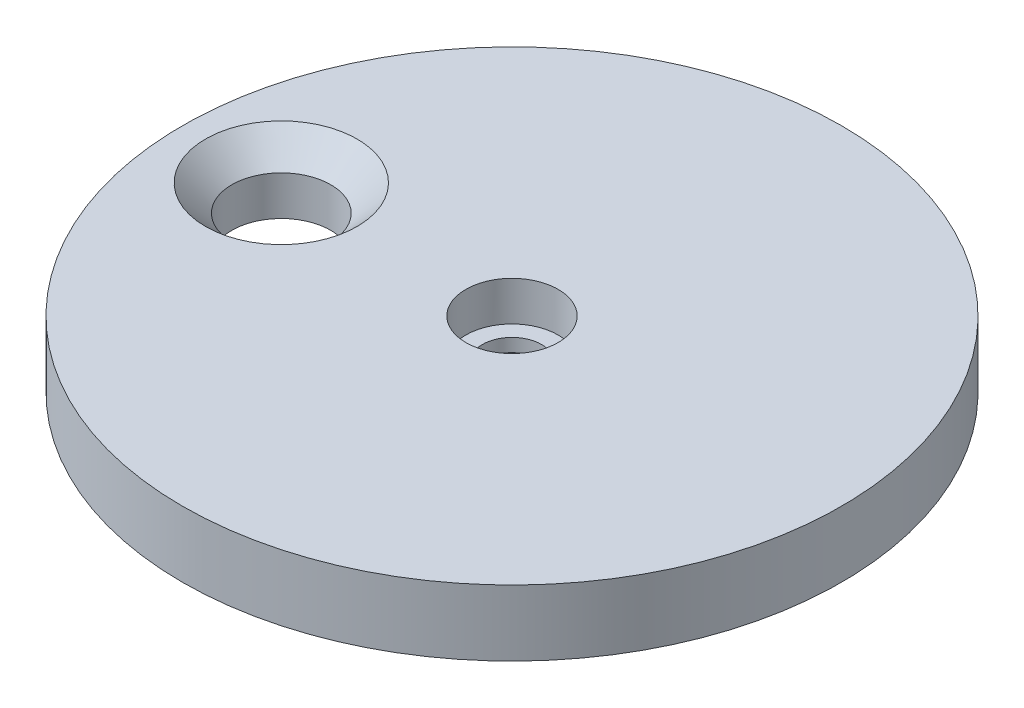
ISO-10303-21;
HEADER;
FILE_DESCRIPTION(('STEP AP214'),'2;1');
FILE_NAME('part.step','',(''),(''),'','','');
FILE_SCHEMA(('AUTOMOTIVE_DESIGN { 1 0 10303 214 1 1 1 1 }'));
ENDSEC;
DATA;
#1=APPLICATION_CONTEXT('core data for automotive mechanical design processes');
#2=APPLICATION_PROTOCOL_DEFINITION('international standard','automotive_design',2000,#1);
#3=PRODUCT_CONTEXT('',#1,'mechanical');
#4=PRODUCT('Part','Part','',(#3));
#5=PRODUCT_RELATED_PRODUCT_CATEGORY('part','',(#4));
#6=PRODUCT_DEFINITION_FORMATION('','',#4);
#7=PRODUCT_DEFINITION_CONTEXT('part definition',#1,'design');
#8=PRODUCT_DEFINITION('design','',#6,#7);
#9=PRODUCT_DEFINITION_SHAPE('','',#8);
#10=(LENGTH_UNIT() NAMED_UNIT(*) SI_UNIT(.MILLI.,.METRE.));
#11=(NAMED_UNIT(*) PLANE_ANGLE_UNIT() SI_UNIT($,.RADIAN.));
#12=(NAMED_UNIT(*) SI_UNIT($,.STERADIAN.) SOLID_ANGLE_UNIT());
#13=UNCERTAINTY_MEASURE_WITH_UNIT(LENGTH_MEASURE(1.E-05),#10,'distance_accuracy_value','');
#14=(GEOMETRIC_REPRESENTATION_CONTEXT(3) GLOBAL_UNCERTAINTY_ASSIGNED_CONTEXT((#13)) GLOBAL_UNIT_ASSIGNED_CONTEXT((#10,
#11,#12)) REPRESENTATION_CONTEXT('',''));
#15=CARTESIAN_POINT('',(0.,0.,0.));
#16=DIRECTION('',(0.,0.,1.));
#17=DIRECTION('',(1.,0.,0.));
#18=AXIS2_PLACEMENT_3D('',#15,#16,#17);
#19=CARTESIAN_POINT('',(0.,10.,0.));
#20=DIRECTION('',(0.,1.,0.));
#21=DIRECTION('',(0.,0.,1.));
#22=AXIS2_PLACEMENT_3D('',#19,#20,#21);
#23=PLANE('',#22);
#24=CARTESIAN_POINT('',(0.,10.,0.));
#25=DIRECTION('',(0.,1.,0.));
#26=DIRECTION('',(0.,0.,1.));
#27=AXIS2_PLACEMENT_3D('',#24,#25,#26);
#28=CIRCLE('',#27,7.);
#29=CARTESIAN_POINT('',(0.,10.,7.));
#30=VERTEX_POINT('',#29);
#31=EDGE_CURVE('E570',#30,#30,#28,.T.);
#32=ORIENTED_EDGE('',*,*,#31,.F.);
#33=EDGE_LOOP('',(#32));
#34=FACE_BOUND('',#33,.T.);
#35=CARTESIAN_POINT('',(-35.,10.,0.));
#36=DIRECTION('',(0.,1.,0.));
#37=DIRECTION('',(0.,0.,1.));
#38=AXIS2_PLACEMENT_3D('',#35,#36,#37);
#39=CIRCLE('',#38,11.5);
#40=CARTESIAN_POINT('',(-35.,10.,11.5));
#41=VERTEX_POINT('',#40);
#42=EDGE_CURVE('E12',#41,#41,#39,.F.);
#43=ORIENTED_EDGE('',*,*,#42,.T.);
#44=EDGE_LOOP('',(#43));
#45=FACE_BOUND('',#44,.T.);
#46=CARTESIAN_POINT('',(0.,10.,0.));
#47=DIRECTION('',(0.,1.,0.));
#48=DIRECTION('',(0.,0.,1.));
#49=AXIS2_PLACEMENT_3D('',#46,#47,#48);
#50=CIRCLE('',#49,50.);
#51=CARTESIAN_POINT('',(0.,10.,50.));
#52=VERTEX_POINT('',#51);
#53=EDGE_CURVE('E214',#52,#52,#50,.T.);
#54=ORIENTED_EDGE('',*,*,#53,.T.);
#55=EDGE_LOOP('',(#54));
#56=FACE_BOUND('',#55,.T.);
#57=ADVANCED_FACE('F35',(#34,#45,#56),#23,.T.);
#58=CARTESIAN_POINT('',(0.,0.,0.));
#59=DIRECTION('',(0.,1.,0.));
#60=DIRECTION('',(0.,0.,1.));
#61=AXIS2_PLACEMENT_3D('',#58,#59,#60);
#62=PLANE('',#61);
#63=DIRECTION('',(0.988417106108938,0.,-0.151761735464618));
#64=VECTOR('',#63,1.);
#65=CARTESIAN_POINT('',(-17.,0.,-2.5));
#66=LINE('',#65,#64);
#67=CARTESIAN_POINT('',(-17.,0.,-2.5));
#68=VERTEX_POINT('',#67);
#69=CARTESIAN_POINT('',(-4.43,0.,-4.43));
#70=VERTEX_POINT('',#69);
#71=EDGE_CURVE('E161',#68,#70,#66,.T.);
#72=ORIENTED_EDGE('',*,*,#71,.F.);
#73=CARTESIAN_POINT('',(-17.,0.,0.));
#74=DIRECTION('',(0.,-1.,0.));
#75=DIRECTION('',(0.,0.,-1.));
#76=AXIS2_PLACEMENT_3D('',#73,#74,#75);
#77=CIRCLE('',#76,2.5);
#78=CARTESIAN_POINT('',(-17.,0.,2.5));
#79=VERTEX_POINT('',#78);
#80=EDGE_CURVE('E51',#79,#68,#77,.T.);
#81=ORIENTED_EDGE('',*,*,#80,.F.);
#82=DIRECTION('',(-0.988417106108938,0.,-0.151761735464618));
#83=VECTOR('',#82,1.);
#84=CARTESIAN_POINT('',(-17.,0.,2.5));
#85=LINE('',#84,#83);
#86=CARTESIAN_POINT('',(-4.43,0.,4.43));
#87=VERTEX_POINT('',#86);
#88=EDGE_CURVE('E189',#87,#79,#85,.T.);
#89=ORIENTED_EDGE('',*,*,#88,.F.);
#90=DIRECTION('',(-0.151761735464618,0.,-0.988417106108938));
#91=VECTOR('',#90,1.);
#92=CARTESIAN_POINT('',(-2.5,0.,17.));
#93=LINE('',#92,#91);
#94=CARTESIAN_POINT('',(-2.5,0.,17.));
#95=VERTEX_POINT('',#94);
#96=EDGE_CURVE('E187',#95,#87,#93,.T.);
#97=ORIENTED_EDGE('',*,*,#96,.F.);
#98=CARTESIAN_POINT('',(0.,0.,17.));
#99=DIRECTION('',(0.,-1.,0.));
#100=DIRECTION('',(0.,0.,-1.));
#101=AXIS2_PLACEMENT_3D('',#98,#99,#100);
#102=CIRCLE('',#101,2.5);
#103=CARTESIAN_POINT('',(2.5,0.,17.));
#104=VERTEX_POINT('',#103);
#105=EDGE_CURVE('E135',#104,#95,#102,.T.);
#106=ORIENTED_EDGE('',*,*,#105,.F.);
#107=DIRECTION('',(-0.151761735464618,0.,0.988417106108938));
#108=VECTOR('',#107,1.);
#109=CARTESIAN_POINT('',(2.5,0.,17.));
#110=LINE('',#109,#108);
#111=CARTESIAN_POINT('',(4.43,0.,4.43));
#112=VERTEX_POINT('',#111);
#113=EDGE_CURVE('E183',#112,#104,#110,.T.);
#114=ORIENTED_EDGE('',*,*,#113,.F.);
#115=DIRECTION('',(-0.988417106108938,0.,0.151761735464618));
#116=VECTOR('',#115,1.);
#117=CARTESIAN_POINT('',(17.,0.,2.5));
#118=LINE('',#117,#116);
#119=CARTESIAN_POINT('',(17.,0.,2.5));
#120=VERTEX_POINT('',#119);
#121=EDGE_CURVE('E180',#120,#112,#118,.T.);
#122=ORIENTED_EDGE('',*,*,#121,.F.);
#123=CARTESIAN_POINT('',(17.,0.,0.));
#124=DIRECTION('',(0.,-1.,0.));
#125=DIRECTION('',(0.,0.,-1.));
#126=AXIS2_PLACEMENT_3D('',#123,#124,#125);
#127=CIRCLE('',#126,2.5);
#128=CARTESIAN_POINT('',(17.,0.,-2.5));
#129=VERTEX_POINT('',#128);
#130=EDGE_CURVE('E177',#129,#120,#127,.T.);
#131=ORIENTED_EDGE('',*,*,#130,.F.);
#132=DIRECTION('',(0.988417106108938,0.,0.151761735464618));
#133=VECTOR('',#132,1.);
#134=CARTESIAN_POINT('',(17.,0.,-2.5));
#135=LINE('',#134,#133);
#136=CARTESIAN_POINT('',(4.43,0.,-4.43));
#137=VERTEX_POINT('',#136);
#138=EDGE_CURVE('E174',#137,#129,#135,.T.);
#139=ORIENTED_EDGE('',*,*,#138,.F.);
#140=DIRECTION('',(0.151761735464618,0.,0.988417106108938));
#141=VECTOR('',#140,1.);
#142=CARTESIAN_POINT('',(2.50000000000001,0.,-17.));
#143=LINE('',#142,#141);
#144=CARTESIAN_POINT('',(2.50000000000001,0.,-17.));
#145=VERTEX_POINT('',#144);
#146=EDGE_CURVE('E171',#145,#137,#143,.T.);
#147=ORIENTED_EDGE('',*,*,#146,.F.);
#148=CARTESIAN_POINT('',(0.,0.,-17.));
#149=DIRECTION('',(0.,-1.,0.));
#150=DIRECTION('',(0.,0.,-1.));
#151=AXIS2_PLACEMENT_3D('',#148,#149,#150);
#152=CIRCLE('',#151,2.5);
#153=CARTESIAN_POINT('',(-2.49999999999999,0.,-17.));
#154=VERTEX_POINT('',#153);
#155=EDGE_CURVE('E168',#154,#145,#152,.T.);
#156=ORIENTED_EDGE('',*,*,#155,.F.);
#157=DIRECTION('',(0.151761735464618,0.,-0.988417106108938));
#158=VECTOR('',#157,1.);
#159=CARTESIAN_POINT('',(-2.49999999999999,0.,-17.));
#160=LINE('',#159,#158);
#161=EDGE_CURVE('E165',#70,#154,#160,.T.);
#162=ORIENTED_EDGE('',*,*,#161,.F.);
#163=EDGE_LOOP('',(#72,#81,#89,#97,#106,#114,#122,#131,#139,#147,#156,#162));
#164=FACE_BOUND('',#163,.T.);
#165=CARTESIAN_POINT('',(0.,0.,0.));
#166=DIRECTION('',(0.,1.,0.));
#167=DIRECTION('',(0.,0.,1.));
#168=AXIS2_PLACEMENT_3D('',#165,#166,#167);
#169=CIRCLE('',#168,50.);
#170=CARTESIAN_POINT('',(0.,0.,50.));
#171=VERTEX_POINT('',#170);
#172=EDGE_CURVE('E213',#171,#171,#169,.T.);
#173=ORIENTED_EDGE('',*,*,#172,.F.);
#174=EDGE_LOOP('',(#173));
#175=FACE_BOUND('',#174,.T.);
#176=CARTESIAN_POINT('',(-35.,0.,0.));
#177=DIRECTION('',(0.,1.,0.));
#178=DIRECTION('',(0.,0.,1.));
#179=AXIS2_PLACEMENT_3D('',#176,#177,#178);
#180=CIRCLE('',#179,7.5);
#181=CARTESIAN_POINT('',(-35.,0.,7.5));
#182=VERTEX_POINT('',#181);
#183=EDGE_CURVE('E193',#182,#182,#180,.T.);
#184=ORIENTED_EDGE('',*,*,#183,.T.);
#185=EDGE_LOOP('',(#184));
#186=FACE_BOUND('',#185,.T.);
#187=ADVANCED_FACE('F239',(#164,#175,#186),#62,.F.);
#188=CARTESIAN_POINT('',(0.,10.,0.));
#189=DIRECTION('',(0.,-1.,0.));
#190=DIRECTION('',(0.,0.,-1.));
#191=AXIS2_PLACEMENT_3D('',#188,#189,#190);
#192=CYLINDRICAL_SURFACE('',#191,50.);
#193=ORIENTED_EDGE('',*,*,#53,.F.);
#194=EDGE_LOOP('',(#193));
#195=FACE_BOUND('',#194,.T.);
#196=ORIENTED_EDGE('',*,*,#172,.T.);
#197=EDGE_LOOP('',(#196));
#198=FACE_BOUND('',#197,.T.);
#199=ADVANCED_FACE('F235',(#195,#198),#192,.T.);
#200=CARTESIAN_POINT('',(-35.,10.,0.));
#201=DIRECTION('',(0.,-1.,0.));
#202=DIRECTION('',(0.,0.,-1.));
#203=AXIS2_PLACEMENT_3D('',#200,#201,#202);
#204=CYLINDRICAL_SURFACE('',#203,7.5);
#205=CARTESIAN_POINT('',(-35.,5.99999999999999,0.));
#206=DIRECTION('',(0.,1.,0.));
#207=DIRECTION('',(0.,0.,1.));
#208=AXIS2_PLACEMENT_3D('',#205,#206,#207);
#209=CIRCLE('',#208,7.5);
#210=CARTESIAN_POINT('',(-35.,5.99999999999999,7.5));
#211=VERTEX_POINT('',#210);
#212=EDGE_CURVE('E44',#211,#211,#209,.T.);
#213=ORIENTED_EDGE('',*,*,#212,.T.);
#214=EDGE_LOOP('',(#213));
#215=FACE_BOUND('',#214,.T.);
#216=ORIENTED_EDGE('',*,*,#183,.F.);
#217=EDGE_LOOP('',(#216));
#218=FACE_BOUND('',#217,.T.);
#219=ADVANCED_FACE('F222',(#215,#218),#204,.F.);
#220=CARTESIAN_POINT('',(-35.,5.99999999999999,0.));
#221=DIRECTION('',(0.,1.,0.));
#222=DIRECTION('',(0.,0.,1.));
#223=AXIS2_PLACEMENT_3D('',#220,#221,#222);
#224=CONICAL_SURFACE('',#223,7.5,0.78539816339745);
#225=ORIENTED_EDGE('',*,*,#42,.F.);
#226=EDGE_LOOP('',(#225));
#227=FACE_BOUND('',#226,.T.);
#228=ORIENTED_EDGE('',*,*,#212,.F.);
#229=EDGE_LOOP('',(#228));
#230=FACE_BOUND('',#229,.T.);
#231=ADVANCED_FACE('F37',(#227,#230),#224,.F.);
#232=CARTESIAN_POINT('',(-17.,2.,0.));
#233=DIRECTION('',(0.,-1.,0.));
#234=DIRECTION('',(0.,0.,-1.));
#235=AXIS2_PLACEMENT_3D('',#232,#233,#234);
#236=CYLINDRICAL_SURFACE('',#235,2.5);
#237=ORIENTED_EDGE('',*,*,#80,.T.);
#238=DIRECTION('',(0.,-1.,0.));
#239=VECTOR('',#238,1.);
#240=CARTESIAN_POINT('',(-17.,2.,-2.5));
#241=LINE('',#240,#239);
#242=CARTESIAN_POINT('',(-17.,2.,-2.5));
#243=VERTEX_POINT('',#242);
#244=EDGE_CURVE('E99',#243,#68,#241,.T.);
#245=ORIENTED_EDGE('',*,*,#244,.F.);
#246=CARTESIAN_POINT('',(-17.,2.,0.));
#247=DIRECTION('',(0.,-1.,0.));
#248=DIRECTION('',(0.,0.,-1.));
#249=AXIS2_PLACEMENT_3D('',#246,#247,#248);
#250=CIRCLE('',#249,2.5);
#251=CARTESIAN_POINT('',(-17.,2.,2.5));
#252=VERTEX_POINT('',#251);
#253=EDGE_CURVE('E191',#252,#243,#250,.T.);
#254=ORIENTED_EDGE('',*,*,#253,.F.);
#255=DIRECTION('',(0.,-1.,0.));
#256=VECTOR('',#255,1.);
#257=CARTESIAN_POINT('',(-17.,2.,2.5));
#258=LINE('',#257,#256);
#259=EDGE_CURVE('E59',#252,#79,#258,.T.);
#260=ORIENTED_EDGE('',*,*,#259,.T.);
#261=EDGE_LOOP('',(#237,#245,#254,#260));
#262=FACE_BOUND('',#261,.T.);
#263=ADVANCED_FACE('F226',(#262),#236,.F.);
#264=CARTESIAN_POINT('',(-17.,2.,2.5));
#265=DIRECTION('',(-0.151761735464618,0.,0.988417106108938));
#266=DIRECTION('',(0.988417106108938,0.,0.151761735464618));
#267=AXIS2_PLACEMENT_3D('',#264,#265,#266);
#268=PLANE('',#267);
#269=ORIENTED_EDGE('',*,*,#88,.T.);
#270=ORIENTED_EDGE('',*,*,#259,.F.);
#271=DIRECTION('',(-0.988417106108938,0.,-0.151761735464618));
#272=VECTOR('',#271,1.);
#273=CARTESIAN_POINT('',(-17.,2.,2.5));
#274=LINE('',#273,#272);
#275=CARTESIAN_POINT('',(-4.43,2.,4.43));
#276=VERTEX_POINT('',#275);
#277=EDGE_CURVE('E147',#276,#252,#274,.T.);
#278=ORIENTED_EDGE('',*,*,#277,.F.);
#279=DIRECTION('',(0.,-1.,0.));
#280=VECTOR('',#279,1.);
#281=CARTESIAN_POINT('',(-4.43,2.,4.43));
#282=LINE('',#281,#280);
#283=EDGE_CURVE('E139',#276,#87,#282,.T.);
#284=ORIENTED_EDGE('',*,*,#283,.T.);
#285=EDGE_LOOP('',(#269,#270,#278,#284));
#286=FACE_BOUND('',#285,.T.);
#287=ADVANCED_FACE('F232',(#286),#268,.F.);
#288=CARTESIAN_POINT('',(-2.5,2.,17.));
#289=DIRECTION('',(-0.988417106108938,0.,0.151761735464618));
#290=DIRECTION('',(0.151761735464618,0.,0.988417106108938));
#291=AXIS2_PLACEMENT_3D('',#288,#289,#290);
#292=PLANE('',#291);
#293=ORIENTED_EDGE('',*,*,#96,.T.);
#294=ORIENTED_EDGE('',*,*,#283,.F.);
#295=DIRECTION('',(-0.151761735464618,0.,-0.988417106108938));
#296=VECTOR('',#295,1.);
#297=CARTESIAN_POINT('',(-2.5,2.,17.));
#298=LINE('',#297,#296);
#299=CARTESIAN_POINT('',(-2.5,2.,17.));
#300=VERTEX_POINT('',#299);
#301=EDGE_CURVE('E143',#300,#276,#298,.T.);
#302=ORIENTED_EDGE('',*,*,#301,.F.);
#303=DIRECTION('',(0.,-1.,0.));
#304=VECTOR('',#303,1.);
#305=CARTESIAN_POINT('',(-2.5,2.,17.));
#306=LINE('',#305,#304);
#307=EDGE_CURVE('E128',#300,#95,#306,.T.);
#308=ORIENTED_EDGE('',*,*,#307,.T.);
#309=EDGE_LOOP('',(#293,#294,#302,#308));
#310=FACE_BOUND('',#309,.T.);
#311=ADVANCED_FACE('F144',(#310),#292,.F.);
#312=CARTESIAN_POINT('',(0.,2.,17.));
#313=DIRECTION('',(0.,-1.,0.));
#314=DIRECTION('',(0.,0.,-1.));
#315=AXIS2_PLACEMENT_3D('',#312,#313,#314);
#316=CYLINDRICAL_SURFACE('',#315,2.5);
#317=ORIENTED_EDGE('',*,*,#105,.T.);
#318=ORIENTED_EDGE('',*,*,#307,.F.);
#319=CARTESIAN_POINT('',(0.,2.,17.));
#320=DIRECTION('',(0.,-1.,0.));
#321=DIRECTION('',(0.,0.,-1.));
#322=AXIS2_PLACEMENT_3D('',#319,#320,#321);
#323=CIRCLE('',#322,2.5);
#324=CARTESIAN_POINT('',(2.5,2.,17.));
#325=VERTEX_POINT('',#324);
#326=EDGE_CURVE('E132',#325,#300,#323,.T.);
#327=ORIENTED_EDGE('',*,*,#326,.F.);
#328=DIRECTION('',(0.,-1.,0.));
#329=VECTOR('',#328,1.);
#330=CARTESIAN_POINT('',(2.5,2.,17.));
#331=LINE('',#330,#329);
#332=EDGE_CURVE('E140',#325,#104,#331,.T.);
#333=ORIENTED_EDGE('',*,*,#332,.T.);
#334=EDGE_LOOP('',(#317,#318,#327,#333));
#335=FACE_BOUND('',#334,.T.);
#336=ADVANCED_FACE('F130',(#335),#316,.F.);
#337=CARTESIAN_POINT('',(2.5,2.,17.));
#338=DIRECTION('',(0.988417106108938,0.,0.151761735464618));
#339=DIRECTION('',(0.151761735464618,0.,-0.988417106108938));
#340=AXIS2_PLACEMENT_3D('',#337,#338,#339);
#341=PLANE('',#340);
#342=ORIENTED_EDGE('',*,*,#113,.T.);
#343=ORIENTED_EDGE('',*,*,#332,.F.);
#344=DIRECTION('',(-0.151761735464618,0.,0.988417106108938));
#345=VECTOR('',#344,1.);
#346=CARTESIAN_POINT('',(2.5,2.,17.));
#347=LINE('',#346,#345);
#348=CARTESIAN_POINT('',(4.43,2.,4.43));
#349=VERTEX_POINT('',#348);
#350=EDGE_CURVE('E153',#349,#325,#347,.T.);
#351=ORIENTED_EDGE('',*,*,#350,.F.);
#352=DIRECTION('',(0.,-1.,0.));
#353=VECTOR('',#352,1.);
#354=CARTESIAN_POINT('',(4.43,2.,4.43));
#355=LINE('',#354,#353);
#356=EDGE_CURVE('E196',#349,#112,#355,.T.);
#357=ORIENTED_EDGE('',*,*,#356,.T.);
#358=EDGE_LOOP('',(#342,#343,#351,#357));
#359=FACE_BOUND('',#358,.T.);
#360=ADVANCED_FACE('F304',(#359),#341,.F.);
#361=CARTESIAN_POINT('',(17.,2.,2.5));
#362=DIRECTION('',(0.151761735464618,0.,0.988417106108938));
#363=DIRECTION('',(0.988417106108938,0.,-0.151761735464618));
#364=AXIS2_PLACEMENT_3D('',#361,#362,#363);
#365=PLANE('',#364);
#366=ORIENTED_EDGE('',*,*,#121,.T.);
#367=ORIENTED_EDGE('',*,*,#356,.F.);
#368=DIRECTION('',(-0.988417106108938,0.,0.151761735464618));
#369=VECTOR('',#368,1.);
#370=CARTESIAN_POINT('',(17.,2.,2.5));
#371=LINE('',#370,#369);
#372=CARTESIAN_POINT('',(17.,2.,2.5));
#373=VERTEX_POINT('',#372);
#374=EDGE_CURVE('E155',#373,#349,#371,.T.);
#375=ORIENTED_EDGE('',*,*,#374,.F.);
#376=DIRECTION('',(0.,-1.,0.));
#377=VECTOR('',#376,1.);
#378=CARTESIAN_POINT('',(17.,2.,2.5));
#379=LINE('',#378,#377);
#380=EDGE_CURVE('E198',#373,#120,#379,.T.);
#381=ORIENTED_EDGE('',*,*,#380,.T.);
#382=EDGE_LOOP('',(#366,#367,#375,#381));
#383=FACE_BOUND('',#382,.T.);
#384=ADVANCED_FACE('F313',(#383),#365,.F.);
#385=CARTESIAN_POINT('',(17.,2.,0.));
#386=DIRECTION('',(0.,-1.,0.));
#387=DIRECTION('',(0.,0.,-1.));
#388=AXIS2_PLACEMENT_3D('',#385,#386,#387);
#389=CYLINDRICAL_SURFACE('',#388,2.5);
#390=ORIENTED_EDGE('',*,*,#130,.T.);
#391=ORIENTED_EDGE('',*,*,#380,.F.);
#392=CARTESIAN_POINT('',(17.,2.,0.));
#393=DIRECTION('',(0.,-1.,0.));
#394=DIRECTION('',(0.,0.,-1.));
#395=AXIS2_PLACEMENT_3D('',#392,#393,#394);
#396=CIRCLE('',#395,2.5);
#397=CARTESIAN_POINT('',(17.,2.,-2.5));
#398=VERTEX_POINT('',#397);
#399=EDGE_CURVE('E532',#398,#373,#396,.T.);
#400=ORIENTED_EDGE('',*,*,#399,.F.);
#401=DIRECTION('',(0.,-1.,0.));
#402=VECTOR('',#401,1.);
#403=CARTESIAN_POINT('',(17.,2.,-2.5));
#404=LINE('',#403,#402);
#405=EDGE_CURVE('E200',#398,#129,#404,.T.);
#406=ORIENTED_EDGE('',*,*,#405,.T.);
#407=EDGE_LOOP('',(#390,#391,#400,#406));
#408=FACE_BOUND('',#407,.T.);
#409=ADVANCED_FACE('F323',(#408),#389,.F.);
#410=CARTESIAN_POINT('',(17.,2.,-2.5));
#411=DIRECTION('',(0.151761735464618,0.,-0.988417106108938));
#412=DIRECTION('',(-0.988417106108938,0.,-0.151761735464618));
#413=AXIS2_PLACEMENT_3D('',#410,#411,#412);
#414=PLANE('',#413);
#415=ORIENTED_EDGE('',*,*,#138,.T.);
#416=ORIENTED_EDGE('',*,*,#405,.F.);
#417=DIRECTION('',(0.988417106108938,0.,0.151761735464618));
#418=VECTOR('',#417,1.);
#419=CARTESIAN_POINT('',(17.,2.,-2.5));
#420=LINE('',#419,#418);
#421=CARTESIAN_POINT('',(4.43,2.,-4.43));
#422=VERTEX_POINT('',#421);
#423=EDGE_CURVE('E529',#422,#398,#420,.T.);
#424=ORIENTED_EDGE('',*,*,#423,.F.);
#425=DIRECTION('',(0.,-1.,0.));
#426=VECTOR('',#425,1.);
#427=CARTESIAN_POINT('',(4.43,2.,-4.43));
#428=LINE('',#427,#426);
#429=EDGE_CURVE('E202',#422,#137,#428,.T.);
#430=ORIENTED_EDGE('',*,*,#429,.T.);
#431=EDGE_LOOP('',(#415,#416,#424,#430));
#432=FACE_BOUND('',#431,.T.);
#433=ADVANCED_FACE('F333',(#432),#414,.F.);
#434=CARTESIAN_POINT('',(2.50000000000001,2.,-17.));
#435=DIRECTION('',(0.988417106108938,0.,-0.151761735464618));
#436=DIRECTION('',(-0.151761735464618,0.,-0.988417106108938));
#437=AXIS2_PLACEMENT_3D('',#434,#435,#436);
#438=PLANE('',#437);
#439=ORIENTED_EDGE('',*,*,#146,.T.);
#440=ORIENTED_EDGE('',*,*,#429,.F.);
#441=DIRECTION('',(0.151761735464618,0.,0.988417106108938));
#442=VECTOR('',#441,1.);
#443=CARTESIAN_POINT('',(2.50000000000001,2.,-17.));
#444=LINE('',#443,#442);
#445=CARTESIAN_POINT('',(2.50000000000001,2.,-17.));
#446=VERTEX_POINT('',#445);
#447=EDGE_CURVE('E526',#446,#422,#444,.T.);
#448=ORIENTED_EDGE('',*,*,#447,.F.);
#449=DIRECTION('',(0.,-1.,0.));
#450=VECTOR('',#449,1.);
#451=CARTESIAN_POINT('',(2.50000000000001,2.,-17.));
#452=LINE('',#451,#450);
#453=EDGE_CURVE('E204',#446,#145,#452,.T.);
#454=ORIENTED_EDGE('',*,*,#453,.T.);
#455=EDGE_LOOP('',(#439,#440,#448,#454));
#456=FACE_BOUND('',#455,.T.);
#457=ADVANCED_FACE('F343',(#456),#438,.F.);
#458=CARTESIAN_POINT('',(0.,2.,-17.));
#459=DIRECTION('',(0.,-1.,0.));
#460=DIRECTION('',(0.,0.,-1.));
#461=AXIS2_PLACEMENT_3D('',#458,#459,#460);
#462=CYLINDRICAL_SURFACE('',#461,2.5);
#463=ORIENTED_EDGE('',*,*,#155,.T.);
#464=ORIENTED_EDGE('',*,*,#453,.F.);
#465=CARTESIAN_POINT('',(0.,2.,-17.));
#466=DIRECTION('',(0.,-1.,0.));
#467=DIRECTION('',(0.,0.,-1.));
#468=AXIS2_PLACEMENT_3D('',#465,#466,#467);
#469=CIRCLE('',#468,2.5);
#470=CARTESIAN_POINT('',(-2.49999999999999,2.,-17.));
#471=VERTEX_POINT('',#470);
#472=EDGE_CURVE('E523',#471,#446,#469,.T.);
#473=ORIENTED_EDGE('',*,*,#472,.F.);
#474=DIRECTION('',(0.,-1.,0.));
#475=VECTOR('',#474,1.);
#476=CARTESIAN_POINT('',(-2.49999999999999,2.,-17.));
#477=LINE('',#476,#475);
#478=EDGE_CURVE('E206',#471,#154,#477,.T.);
#479=ORIENTED_EDGE('',*,*,#478,.T.);
#480=EDGE_LOOP('',(#463,#464,#473,#479));
#481=FACE_BOUND('',#480,.T.);
#482=ADVANCED_FACE('F353',(#481),#462,.F.);
#483=CARTESIAN_POINT('',(-2.49999999999999,2.,-17.));
#484=DIRECTION('',(-0.988417106108938,0.,-0.151761735464618));
#485=DIRECTION('',(-0.151761735464618,0.,0.988417106108938));
#486=AXIS2_PLACEMENT_3D('',#483,#484,#485);
#487=PLANE('',#486);
#488=ORIENTED_EDGE('',*,*,#161,.T.);
#489=ORIENTED_EDGE('',*,*,#478,.F.);
#490=DIRECTION('',(0.151761735464618,0.,-0.988417106108938));
#491=VECTOR('',#490,1.);
#492=CARTESIAN_POINT('',(-2.49999999999999,2.,-17.));
#493=LINE('',#492,#491);
#494=CARTESIAN_POINT('',(-4.43,2.,-4.43));
#495=VERTEX_POINT('',#494);
#496=EDGE_CURVE('E520',#495,#471,#493,.T.);
#497=ORIENTED_EDGE('',*,*,#496,.F.);
#498=DIRECTION('',(0.,-1.,0.));
#499=VECTOR('',#498,1.);
#500=CARTESIAN_POINT('',(-4.43,2.,-4.43));
#501=LINE('',#500,#499);
#502=EDGE_CURVE('E208',#495,#70,#501,.T.);
#503=ORIENTED_EDGE('',*,*,#502,.T.);
#504=EDGE_LOOP('',(#488,#489,#497,#503));
#505=FACE_BOUND('',#504,.T.);
#506=ADVANCED_FACE('F363',(#505),#487,.F.);
#507=CARTESIAN_POINT('',(-17.,2.,-2.5));
#508=DIRECTION('',(-0.151761735464618,0.,-0.988417106108938));
#509=DIRECTION('',(-0.988417106108938,0.,0.151761735464618));
#510=AXIS2_PLACEMENT_3D('',#507,#508,#509);
#511=PLANE('',#510);
#512=ORIENTED_EDGE('',*,*,#71,.T.);
#513=ORIENTED_EDGE('',*,*,#502,.F.);
#514=DIRECTION('',(0.988417106108938,0.,-0.151761735464618));
#515=VECTOR('',#514,1.);
#516=CARTESIAN_POINT('',(-17.,2.,-2.5));
#517=LINE('',#516,#515);
#518=EDGE_CURVE('E517',#243,#495,#517,.T.);
#519=ORIENTED_EDGE('',*,*,#518,.F.);
#520=ORIENTED_EDGE('',*,*,#244,.T.);
#521=EDGE_LOOP('',(#512,#513,#519,#520));
#522=FACE_BOUND('',#521,.T.);
#523=ADVANCED_FACE('F373',(#522),#511,.F.);
#524=CARTESIAN_POINT('',(-17.,2.,0.));
#525=DIRECTION('',(0.,-1.,0.));
#526=DIRECTION('',(0.,0.,-1.));
#527=AXIS2_PLACEMENT_3D('',#524,#525,#526);
#528=PLANE('',#527);
#529=CARTESIAN_POINT('',(-16.,2.,0.));
#530=DIRECTION('',(0.,-1.,0.));
#531=DIRECTION('',(0.,0.,-1.));
#532=AXIS2_PLACEMENT_3D('',#529,#530,#531);
#533=CIRCLE('',#532,1.);
#534=CARTESIAN_POINT('',(-16.,2.,-1.));
#535=VERTEX_POINT('',#534);
#536=EDGE_CURVE('E510',#535,#535,#533,.T.);
#537=ORIENTED_EDGE('',*,*,#536,.F.);
#538=EDGE_LOOP('',(#537));
#539=FACE_BOUND('',#538,.T.);
#540=CARTESIAN_POINT('',(0.,2.,16.));
#541=DIRECTION('',(0.,-1.,0.));
#542=DIRECTION('',(0.,0.,-1.));
#543=AXIS2_PLACEMENT_3D('',#540,#541,#542);
#544=CIRCLE('',#543,1.);
#545=CARTESIAN_POINT('',(0.,2.,15.));
#546=VERTEX_POINT('',#545);
#547=EDGE_CURVE('E557',#546,#546,#544,.T.);
#548=ORIENTED_EDGE('',*,*,#547,.F.);
#549=EDGE_LOOP('',(#548));
#550=FACE_BOUND('',#549,.T.);
#551=CARTESIAN_POINT('',(16.,2.,0.));
#552=DIRECTION('',(0.,-1.,0.));
#553=DIRECTION('',(0.,0.,-1.));
#554=AXIS2_PLACEMENT_3D('',#551,#552,#553);
#555=CIRCLE('',#554,1.);
#556=CARTESIAN_POINT('',(16.,2.,-1.));
#557=VERTEX_POINT('',#556);
#558=EDGE_CURVE('E550',#557,#557,#555,.T.);
#559=ORIENTED_EDGE('',*,*,#558,.F.);
#560=EDGE_LOOP('',(#559));
#561=FACE_BOUND('',#560,.T.);
#562=CARTESIAN_POINT('',(0.,2.,-16.));
#563=DIRECTION('',(0.,-1.,0.));
#564=DIRECTION('',(0.,0.,-1.));
#565=AXIS2_PLACEMENT_3D('',#562,#563,#564);
#566=CIRCLE('',#565,1.);
#567=CARTESIAN_POINT('',(0.,2.,-17.));
#568=VERTEX_POINT('',#567);
#569=EDGE_CURVE('E551',#568,#568,#566,.T.);
#570=ORIENTED_EDGE('',*,*,#569,.F.);
#571=EDGE_LOOP('',(#570));
#572=FACE_BOUND('',#571,.T.);
#573=CARTESIAN_POINT('',(0.,2.,0.));
#574=DIRECTION('',(0.,-1.,0.));
#575=DIRECTION('',(0.,0.,-1.));
#576=AXIS2_PLACEMENT_3D('',#573,#574,#575);
#577=CIRCLE('',#576,4.5);
#578=CARTESIAN_POINT('',(0.,2.,-4.5));
#579=VERTEX_POINT('',#578);
#580=EDGE_CURVE('E162',#579,#579,#577,.T.);
#581=ORIENTED_EDGE('',*,*,#580,.F.);
#582=EDGE_LOOP('',(#581));
#583=FACE_BOUND('',#582,.T.);
#584=ORIENTED_EDGE('',*,*,#253,.T.);
#585=ORIENTED_EDGE('',*,*,#518,.T.);
#586=ORIENTED_EDGE('',*,*,#496,.T.);
#587=ORIENTED_EDGE('',*,*,#472,.T.);
#588=ORIENTED_EDGE('',*,*,#447,.T.);
#589=ORIENTED_EDGE('',*,*,#423,.T.);
#590=ORIENTED_EDGE('',*,*,#399,.T.);
#591=ORIENTED_EDGE('',*,*,#374,.T.);
#592=ORIENTED_EDGE('',*,*,#350,.T.);
#593=ORIENTED_EDGE('',*,*,#326,.T.);
#594=ORIENTED_EDGE('',*,*,#301,.T.);
#595=ORIENTED_EDGE('',*,*,#277,.T.);
#596=EDGE_LOOP('',(#584,#585,#586,#587,#588,#589,#590,#591,#592,#593,#594,#595));
#597=FACE_BOUND('',#596,.T.);
#598=ADVANCED_FACE('F150',(#539,#550,#561,#572,#583,#597),#528,.T.);
#599=CARTESIAN_POINT('',(0.,10.001,0.));
#600=DIRECTION('',(0.,-1.,0.));
#601=DIRECTION('',(0.,0.,-1.));
#602=AXIS2_PLACEMENT_3D('',#599,#600,#601);
#603=CYLINDRICAL_SURFACE('',#602,4.5);
#604=CARTESIAN_POINT('',(0.,4.,0.));
#605=DIRECTION('',(0.,-1.,0.));
#606=DIRECTION('',(0.,0.,-1.));
#607=AXIS2_PLACEMENT_3D('',#604,#605,#606);
#608=CIRCLE('',#607,4.5);
#609=CARTESIAN_POINT('',(0.,4.,-4.5));
#610=VERTEX_POINT('',#609);
#611=EDGE_CURVE('E39',#610,#610,#608,.F.);
#612=ORIENTED_EDGE('',*,*,#611,.T.);
#613=EDGE_LOOP('',(#612));
#614=FACE_BOUND('',#613,.T.);
#615=ORIENTED_EDGE('',*,*,#580,.T.);
#616=EDGE_LOOP('',(#615));
#617=FACE_BOUND('',#616,.T.);
#618=ADVANCED_FACE('F392',(#614,#617),#603,.F.);
#619=CARTESIAN_POINT('',(0.,9.,0.));
#620=DIRECTION('',(0.,1.,0.));
#621=DIRECTION('',(0.,0.,1.));
#622=AXIS2_PLACEMENT_3D('',#619,#620,#621);
#623=PLANE('',#622);
#624=CARTESIAN_POINT('',(0.,9.,-16.));
#625=DIRECTION('',(0.,1.,0.));
#626=DIRECTION('',(0.,0.,1.));
#627=AXIS2_PLACEMENT_3D('',#624,#625,#626);
#628=CIRCLE('',#627,1.);
#629=CARTESIAN_POINT('',(0.,9.,-17.));
#630=VERTEX_POINT('',#629);
#631=EDGE_CURVE('E514',#630,#630,#628,.F.);
#632=ORIENTED_EDGE('',*,*,#631,.T.);
#633=EDGE_LOOP('',(#632));
#634=FACE_BOUND('',#633,.T.);
#635=ADVANCED_FACE('F397',(#634),#623,.F.);
#636=CARTESIAN_POINT('',(0.,12.8284271247462,-16.));
#637=DIRECTION('',(0.,-1.,0.));
#638=DIRECTION('',(0.,0.,-1.));
#639=AXIS2_PLACEMENT_3D('',#636,#637,#638);
#640=CYLINDRICAL_SURFACE('',#639,1.);
#641=CARTESIAN_POINT('',(0.,2.,-17.));
#642=CARTESIAN_POINT('',(0.,2.07291666666667,-17.));
#643=CARTESIAN_POINT('',(0.,2.14583333333334,-17.));
#644=CARTESIAN_POINT('',(0.,2.29166666666667,-17.));
#645=CARTESIAN_POINT('',(0.,2.36458333333334,-17.));
#646=CARTESIAN_POINT('',(0.,2.51041666666667,-17.));
#647=CARTESIAN_POINT('',(0.,2.58333333333334,-17.));
#648=CARTESIAN_POINT('',(0.,2.72916666666667,-17.));
#649=CARTESIAN_POINT('',(0.,2.80208333333334,-17.));
#650=CARTESIAN_POINT('',(0.,2.94791666666667,-17.));
#651=CARTESIAN_POINT('',(0.,3.02083333333333,-17.));
#652=CARTESIAN_POINT('',(0.,3.16666666666667,-17.));
#653=CARTESIAN_POINT('',(0.,3.23958333333333,-17.));
#654=CARTESIAN_POINT('',(0.,3.38541666666667,-17.));
#655=CARTESIAN_POINT('',(0.,3.45833333333333,-17.));
#656=CARTESIAN_POINT('',(0.,3.60416666666667,-17.));
#657=CARTESIAN_POINT('',(0.,3.67708333333333,-17.));
#658=CARTESIAN_POINT('',(0.,3.82291666666667,-17.));
#659=CARTESIAN_POINT('',(0.,3.89583333333333,-17.));
#660=CARTESIAN_POINT('',(0.,4.04166666666667,-17.));
#661=CARTESIAN_POINT('',(0.,4.11458333333334,-17.));
#662=CARTESIAN_POINT('',(0.,4.26041666666667,-17.));
#663=CARTESIAN_POINT('',(0.,4.33333333333333,-17.));
#664=CARTESIAN_POINT('',(0.,4.47916666666667,-17.));
#665=CARTESIAN_POINT('',(0.,4.55208333333333,-17.));
#666=CARTESIAN_POINT('',(0.,4.69791666666667,-17.));
#667=CARTESIAN_POINT('',(0.,4.77083333333333,-17.));
#668=CARTESIAN_POINT('',(0.,4.91666666666667,-17.));
#669=CARTESIAN_POINT('',(0.,4.98958333333333,-17.));
#670=CARTESIAN_POINT('',(0.,5.13541666666667,-17.));
#671=CARTESIAN_POINT('',(0.,5.20833333333333,-17.));
#672=CARTESIAN_POINT('',(0.,5.35416666666667,-17.));
#673=CARTESIAN_POINT('',(0.,5.42708333333333,-17.));
#674=CARTESIAN_POINT('',(0.,5.57291666666667,-17.));
#675=CARTESIAN_POINT('',(0.,5.64583333333333,-17.));
#676=CARTESIAN_POINT('',(0.,5.79166666666667,-17.));
#677=CARTESIAN_POINT('',(0.,5.86458333333333,-17.));
#678=CARTESIAN_POINT('',(0.,6.01041666666667,-17.));
#679=CARTESIAN_POINT('',(0.,6.08333333333333,-17.));
#680=CARTESIAN_POINT('',(0.,6.22916666666667,-17.));
#681=CARTESIAN_POINT('',(0.,6.30208333333333,-17.));
#682=CARTESIAN_POINT('',(0.,6.44791666666667,-17.));
#683=CARTESIAN_POINT('',(0.,6.52083333333333,-17.));
#684=CARTESIAN_POINT('',(0.,6.66666666666667,-17.));
#685=CARTESIAN_POINT('',(0.,6.73958333333333,-17.));
#686=CARTESIAN_POINT('',(0.,6.88541666666667,-17.));
#687=CARTESIAN_POINT('',(0.,6.95833333333333,-17.));
#688=CARTESIAN_POINT('',(0.,7.10416666666667,-17.));
#689=CARTESIAN_POINT('',(0.,7.17708333333333,-17.));
#690=CARTESIAN_POINT('',(0.,7.32291666666667,-17.));
#691=CARTESIAN_POINT('',(0.,7.39583333333333,-17.));
#692=CARTESIAN_POINT('',(0.,7.54166666666667,-17.));
#693=CARTESIAN_POINT('',(0.,7.61458333333333,-17.));
#694=CARTESIAN_POINT('',(0.,7.76041666666667,-17.));
#695=CARTESIAN_POINT('',(0.,7.83333333333333,-17.));
#696=CARTESIAN_POINT('',(0.,7.97916666666667,-17.));
#697=CARTESIAN_POINT('',(0.,8.05208333333333,-17.));
#698=CARTESIAN_POINT('',(0.,8.19791666666667,-17.));
#699=CARTESIAN_POINT('',(0.,8.27083333333333,-17.));
#700=CARTESIAN_POINT('',(0.,8.41666666666667,-17.));
#701=CARTESIAN_POINT('',(0.,8.48958333333333,-17.));
#702=CARTESIAN_POINT('',(0.,8.63541666666667,-17.));
#703=CARTESIAN_POINT('',(0.,8.70833333333333,-17.));
#704=CARTESIAN_POINT('',(0.,8.85416666666667,-17.));
#705=CARTESIAN_POINT('',(0.,8.92708333333333,-17.));
#706=CARTESIAN_POINT('',(0.,9.,-17.));
#707=B_SPLINE_CURVE_WITH_KNOTS('',3,(#641,#642,#643,#644,#645,#646,#647,#648,#649,#650,#651,
#652,#653,#654,#655,#656,#657,#658,#659,#660,#661,#662,#663,#664,#665,#666,#667,#668,#669,#670,
#671,#672,#673,#674,#675,#676,#677,#678,#679,#680,#681,#682,#683,#684,#685,#686,#687,#688,#689,
#690,#691,#692,#693,#694,#695,#696,#697,#698,#699,#700,#701,#702,#703,#704,#705,#706),
.UNSPECIFIED.,.F.,.F.,(4,2,2,2,2,2,2,2,2,2,2,2,2,2,2,2,2,2,2,2,2,2,2,2,2,2,2,2,2,2,2,2,4),(0.,
0.21875,0.4375,0.656250000000001,0.875000000000001,1.09375,1.3125,1.53125,1.75,1.96875,2.1875,
2.40625,2.625,2.84375,3.0625,3.28125,3.5,3.71875,3.9375,4.15625,4.375,4.59375,4.8125,5.03125,
5.25,5.46875,5.6875,5.90625,6.125,6.34375,6.5625,6.78125,7.),.UNSPECIFIED.);
#708=EDGE_CURVE('BSEAM402',#568,#630,#707,.T.);
#709=ORIENTED_EDGE('',*,*,#569,.T.);
#710=ORIENTED_EDGE('',*,*,#631,.F.);
#711=ORIENTED_EDGE('',*,*,#708,.T.);
#712=ORIENTED_EDGE('',*,*,#708,.F.);
#713=EDGE_LOOP('',(#709,#711,#710,#712));
#714=FACE_BOUND('',#713,.T.);
#715=ADVANCED_FACE('F402',(#714),#640,.F.);
#716=CARTESIAN_POINT('',(0.,9.,0.));
#717=DIRECTION('',(0.,1.,0.));
#718=DIRECTION('',(0.,0.,1.));
#719=AXIS2_PLACEMENT_3D('',#716,#717,#718);
#720=PLANE('',#719);
#721=CARTESIAN_POINT('',(16.,9.,0.));
#722=DIRECTION('',(0.,1.,0.));
#723=DIRECTION('',(0.,0.,1.));
#724=AXIS2_PLACEMENT_3D('',#721,#722,#723);
#725=CIRCLE('',#724,1.);
#726=CARTESIAN_POINT('',(16.,9.,-1.));
#727=VERTEX_POINT('',#726);
#728=EDGE_CURVE('E554',#727,#727,#725,.F.);
#729=ORIENTED_EDGE('',*,*,#728,.T.);
#730=EDGE_LOOP('',(#729));
#731=FACE_BOUND('',#730,.T.);
#732=ADVANCED_FACE('F413',(#731),#720,.F.);
#733=CARTESIAN_POINT('',(16.,12.8284271247462,0.));
#734=DIRECTION('',(0.,-1.,0.));
#735=DIRECTION('',(0.,0.,-1.));
#736=AXIS2_PLACEMENT_3D('',#733,#734,#735);
#737=CYLINDRICAL_SURFACE('',#736,1.);
#738=CARTESIAN_POINT('',(16.,2.,-1.));
#739=CARTESIAN_POINT('',(16.,2.07291666666667,-1.));
#740=CARTESIAN_POINT('',(16.,2.14583333333334,-1.));
#741=CARTESIAN_POINT('',(16.,2.29166666666667,-1.));
#742=CARTESIAN_POINT('',(16.,2.36458333333334,-1.));
#743=CARTESIAN_POINT('',(16.,2.51041666666667,-1.));
#744=CARTESIAN_POINT('',(16.,2.58333333333334,-1.));
#745=CARTESIAN_POINT('',(16.,2.72916666666667,-1.));
#746=CARTESIAN_POINT('',(16.,2.80208333333334,-1.));
#747=CARTESIAN_POINT('',(16.,2.94791666666667,-1.));
#748=CARTESIAN_POINT('',(16.,3.02083333333333,-1.));
#749=CARTESIAN_POINT('',(16.,3.16666666666667,-1.));
#750=CARTESIAN_POINT('',(16.,3.23958333333333,-1.));
#751=CARTESIAN_POINT('',(16.,3.38541666666667,-1.));
#752=CARTESIAN_POINT('',(16.,3.45833333333333,-1.));
#753=CARTESIAN_POINT('',(16.,3.60416666666667,-1.));
#754=CARTESIAN_POINT('',(16.,3.67708333333333,-1.));
#755=CARTESIAN_POINT('',(16.,3.82291666666667,-1.));
#756=CARTESIAN_POINT('',(16.,3.89583333333333,-1.));
#757=CARTESIAN_POINT('',(16.,4.04166666666667,-1.));
#758=CARTESIAN_POINT('',(16.,4.11458333333334,-1.));
#759=CARTESIAN_POINT('',(16.,4.26041666666667,-1.));
#760=CARTESIAN_POINT('',(16.,4.33333333333333,-1.));
#761=CARTESIAN_POINT('',(16.,4.47916666666667,-1.));
#762=CARTESIAN_POINT('',(16.,4.55208333333333,-1.));
#763=CARTESIAN_POINT('',(16.,4.69791666666667,-1.));
#764=CARTESIAN_POINT('',(16.,4.77083333333333,-1.));
#765=CARTESIAN_POINT('',(16.,4.91666666666667,-1.));
#766=CARTESIAN_POINT('',(16.,4.98958333333333,-1.));
#767=CARTESIAN_POINT('',(16.,5.13541666666667,-1.));
#768=CARTESIAN_POINT('',(16.,5.20833333333333,-1.));
#769=CARTESIAN_POINT('',(16.,5.35416666666667,-1.));
#770=CARTESIAN_POINT('',(16.,5.42708333333333,-1.));
#771=CARTESIAN_POINT('',(16.,5.57291666666667,-1.));
#772=CARTESIAN_POINT('',(16.,5.64583333333333,-1.));
#773=CARTESIAN_POINT('',(16.,5.79166666666667,-1.));
#774=CARTESIAN_POINT('',(16.,5.86458333333333,-1.));
#775=CARTESIAN_POINT('',(16.,6.01041666666667,-1.));
#776=CARTESIAN_POINT('',(16.,6.08333333333333,-1.));
#777=CARTESIAN_POINT('',(16.,6.22916666666667,-1.));
#778=CARTESIAN_POINT('',(16.,6.30208333333333,-1.));
#779=CARTESIAN_POINT('',(16.,6.44791666666667,-1.));
#780=CARTESIAN_POINT('',(16.,6.52083333333333,-1.));
#781=CARTESIAN_POINT('',(16.,6.66666666666667,-1.));
#782=CARTESIAN_POINT('',(16.,6.73958333333333,-1.));
#783=CARTESIAN_POINT('',(16.,6.88541666666667,-1.));
#784=CARTESIAN_POINT('',(16.,6.95833333333333,-1.));
#785=CARTESIAN_POINT('',(16.,7.10416666666667,-1.));
#786=CARTESIAN_POINT('',(16.,7.17708333333333,-1.));
#787=CARTESIAN_POINT('',(16.,7.32291666666667,-1.));
#788=CARTESIAN_POINT('',(16.,7.39583333333333,-1.));
#789=CARTESIAN_POINT('',(16.,7.54166666666667,-1.));
#790=CARTESIAN_POINT('',(16.,7.61458333333333,-1.));
#791=CARTESIAN_POINT('',(16.,7.76041666666667,-1.));
#792=CARTESIAN_POINT('',(16.,7.83333333333333,-1.));
#793=CARTESIAN_POINT('',(16.,7.97916666666667,-1.));
#794=CARTESIAN_POINT('',(16.,8.05208333333333,-1.));
#795=CARTESIAN_POINT('',(16.,8.19791666666667,-1.));
#796=CARTESIAN_POINT('',(16.,8.27083333333333,-1.));
#797=CARTESIAN_POINT('',(16.,8.41666666666667,-1.));
#798=CARTESIAN_POINT('',(16.,8.48958333333333,-1.));
#799=CARTESIAN_POINT('',(16.,8.63541666666667,-1.));
#800=CARTESIAN_POINT('',(16.,8.70833333333333,-1.));
#801=CARTESIAN_POINT('',(16.,8.85416666666667,-1.));
#802=CARTESIAN_POINT('',(16.,8.92708333333333,-1.));
#803=CARTESIAN_POINT('',(16.,9.,-1.));
#804=B_SPLINE_CURVE_WITH_KNOTS('',3,(#738,#739,#740,#741,#742,#743,#744,#745,#746,#747,#748,
#749,#750,#751,#752,#753,#754,#755,#756,#757,#758,#759,#760,#761,#762,#763,#764,#765,#766,#767,
#768,#769,#770,#771,#772,#773,#774,#775,#776,#777,#778,#779,#780,#781,#782,#783,#784,#785,#786,
#787,#788,#789,#790,#791,#792,#793,#794,#795,#796,#797,#798,#799,#800,#801,#802,#803),
.UNSPECIFIED.,.F.,.F.,(4,2,2,2,2,2,2,2,2,2,2,2,2,2,2,2,2,2,2,2,2,2,2,2,2,2,2,2,2,2,2,2,4),(0.,
0.21875,0.4375,0.656250000000001,0.875000000000001,1.09375,1.3125,1.53125,1.75,1.96875,2.1875,
2.40625,2.625,2.84375,3.0625,3.28125,3.5,3.71875,3.9375,4.15625,4.375,4.59375,4.8125,5.03125,
5.25,5.46875,5.6875,5.90625,6.125,6.34375,6.5625,6.78125,7.),.UNSPECIFIED.);
#805=EDGE_CURVE('BSEAM423',#557,#727,#804,.T.);
#806=ORIENTED_EDGE('',*,*,#558,.T.);
#807=ORIENTED_EDGE('',*,*,#728,.F.);
#808=ORIENTED_EDGE('',*,*,#805,.T.);
#809=ORIENTED_EDGE('',*,*,#805,.F.);
#810=EDGE_LOOP('',(#806,#808,#807,#809));
#811=FACE_BOUND('',#810,.T.);
#812=ADVANCED_FACE('F423',(#811),#737,.F.);
#813=CARTESIAN_POINT('',(0.,9.,0.));
#814=DIRECTION('',(0.,1.,0.));
#815=DIRECTION('',(0.,0.,1.));
#816=AXIS2_PLACEMENT_3D('',#813,#814,#815);
#817=PLANE('',#816);
#818=CARTESIAN_POINT('',(0.,9.,16.));
#819=DIRECTION('',(0.,1.,0.));
#820=DIRECTION('',(0.,0.,1.));
#821=AXIS2_PLACEMENT_3D('',#818,#819,#820);
#822=CIRCLE('',#821,1.);
#823=CARTESIAN_POINT('',(0.,9.,15.));
#824=VERTEX_POINT('',#823);
#825=EDGE_CURVE('E560',#824,#824,#822,.F.);
#826=ORIENTED_EDGE('',*,*,#825,.T.);
#827=EDGE_LOOP('',(#826));
#828=FACE_BOUND('',#827,.T.);
#829=ADVANCED_FACE('F433',(#828),#817,.F.);
#830=CARTESIAN_POINT('',(0.,12.8284271247462,16.));
#831=DIRECTION('',(0.,-1.,0.));
#832=DIRECTION('',(0.,0.,-1.));
#833=AXIS2_PLACEMENT_3D('',#830,#831,#832);
#834=CYLINDRICAL_SURFACE('',#833,1.);
#835=CARTESIAN_POINT('',(0.,2.,15.));
#836=CARTESIAN_POINT('',(0.,2.07291666666667,15.));
#837=CARTESIAN_POINT('',(0.,2.14583333333334,15.));
#838=CARTESIAN_POINT('',(0.,2.29166666666667,15.));
#839=CARTESIAN_POINT('',(0.,2.36458333333334,15.));
#840=CARTESIAN_POINT('',(0.,2.51041666666667,15.));
#841=CARTESIAN_POINT('',(0.,2.58333333333334,15.));
#842=CARTESIAN_POINT('',(0.,2.72916666666667,15.));
#843=CARTESIAN_POINT('',(0.,2.80208333333334,15.));
#844=CARTESIAN_POINT('',(0.,2.94791666666667,15.));
#845=CARTESIAN_POINT('',(0.,3.02083333333333,15.));
#846=CARTESIAN_POINT('',(0.,3.16666666666667,15.));
#847=CARTESIAN_POINT('',(0.,3.23958333333333,15.));
#848=CARTESIAN_POINT('',(0.,3.38541666666667,15.));
#849=CARTESIAN_POINT('',(0.,3.45833333333333,15.));
#850=CARTESIAN_POINT('',(0.,3.60416666666667,15.));
#851=CARTESIAN_POINT('',(0.,3.67708333333333,15.));
#852=CARTESIAN_POINT('',(0.,3.82291666666667,15.));
#853=CARTESIAN_POINT('',(0.,3.89583333333333,15.));
#854=CARTESIAN_POINT('',(0.,4.04166666666667,15.));
#855=CARTESIAN_POINT('',(0.,4.11458333333334,15.));
#856=CARTESIAN_POINT('',(0.,4.26041666666667,15.));
#857=CARTESIAN_POINT('',(0.,4.33333333333333,15.));
#858=CARTESIAN_POINT('',(0.,4.47916666666667,15.));
#859=CARTESIAN_POINT('',(0.,4.55208333333333,15.));
#860=CARTESIAN_POINT('',(0.,4.69791666666667,15.));
#861=CARTESIAN_POINT('',(0.,4.77083333333333,15.));
#862=CARTESIAN_POINT('',(0.,4.91666666666667,15.));
#863=CARTESIAN_POINT('',(0.,4.98958333333333,15.));
#864=CARTESIAN_POINT('',(0.,5.13541666666667,15.));
#865=CARTESIAN_POINT('',(0.,5.20833333333333,15.));
#866=CARTESIAN_POINT('',(0.,5.35416666666667,15.));
#867=CARTESIAN_POINT('',(0.,5.42708333333333,15.));
#868=CARTESIAN_POINT('',(0.,5.57291666666667,15.));
#869=CARTESIAN_POINT('',(0.,5.64583333333333,15.));
#870=CARTESIAN_POINT('',(0.,5.79166666666667,15.));
#871=CARTESIAN_POINT('',(0.,5.86458333333333,15.));
#872=CARTESIAN_POINT('',(0.,6.01041666666667,15.));
#873=CARTESIAN_POINT('',(0.,6.08333333333333,15.));
#874=CARTESIAN_POINT('',(0.,6.22916666666667,15.));
#875=CARTESIAN_POINT('',(0.,6.30208333333333,15.));
#876=CARTESIAN_POINT('',(0.,6.44791666666667,15.));
#877=CARTESIAN_POINT('',(0.,6.52083333333333,15.));
#878=CARTESIAN_POINT('',(0.,6.66666666666667,15.));
#879=CARTESIAN_POINT('',(0.,6.73958333333333,15.));
#880=CARTESIAN_POINT('',(0.,6.88541666666667,15.));
#881=CARTESIAN_POINT('',(0.,6.95833333333333,15.));
#882=CARTESIAN_POINT('',(0.,7.10416666666667,15.));
#883=CARTESIAN_POINT('',(0.,7.17708333333333,15.));
#884=CARTESIAN_POINT('',(0.,7.32291666666667,15.));
#885=CARTESIAN_POINT('',(0.,7.39583333333333,15.));
#886=CARTESIAN_POINT('',(0.,7.54166666666667,15.));
#887=CARTESIAN_POINT('',(0.,7.61458333333333,15.));
#888=CARTESIAN_POINT('',(0.,7.76041666666667,15.));
#889=CARTESIAN_POINT('',(0.,7.83333333333333,15.));
#890=CARTESIAN_POINT('',(0.,7.97916666666667,15.));
#891=CARTESIAN_POINT('',(0.,8.05208333333333,15.));
#892=CARTESIAN_POINT('',(0.,8.19791666666667,15.));
#893=CARTESIAN_POINT('',(0.,8.27083333333333,15.));
#894=CARTESIAN_POINT('',(0.,8.41666666666667,15.));
#895=CARTESIAN_POINT('',(0.,8.48958333333333,15.));
#896=CARTESIAN_POINT('',(0.,8.63541666666667,15.));
#897=CARTESIAN_POINT('',(0.,8.70833333333333,15.));
#898=CARTESIAN_POINT('',(0.,8.85416666666667,15.));
#899=CARTESIAN_POINT('',(0.,8.92708333333333,15.));
#900=CARTESIAN_POINT('',(0.,9.,15.));
#901=B_SPLINE_CURVE_WITH_KNOTS('',3,(#835,#836,#837,#838,#839,#840,#841,#842,#843,#844,#845,
#846,#847,#848,#849,#850,#851,#852,#853,#854,#855,#856,#857,#858,#859,#860,#861,#862,#863,#864,
#865,#866,#867,#868,#869,#870,#871,#872,#873,#874,#875,#876,#877,#878,#879,#880,#881,#882,#883,
#884,#885,#886,#887,#888,#889,#890,#891,#892,#893,#894,#895,#896,#897,#898,#899,#900),
.UNSPECIFIED.,.F.,.F.,(4,2,2,2,2,2,2,2,2,2,2,2,2,2,2,2,2,2,2,2,2,2,2,2,2,2,2,2,2,2,2,2,4),(0.,
0.21875,0.4375,0.656250000000001,0.875000000000001,1.09375,1.3125,1.53125,1.75,1.96875,2.1875,
2.40625,2.625,2.84375,3.0625,3.28125,3.5,3.71875,3.9375,4.15625,4.375,4.59375,4.8125,5.03125,
5.25,5.46875,5.6875,5.90625,6.125,6.34375,6.5625,6.78125,7.),.UNSPECIFIED.);
#902=EDGE_CURVE('BSEAM443',#546,#824,#901,.T.);
#903=ORIENTED_EDGE('',*,*,#547,.T.);
#904=ORIENTED_EDGE('',*,*,#825,.F.);
#905=ORIENTED_EDGE('',*,*,#902,.T.);
#906=ORIENTED_EDGE('',*,*,#902,.F.);
#907=EDGE_LOOP('',(#903,#905,#904,#906));
#908=FACE_BOUND('',#907,.T.);
#909=ADVANCED_FACE('F443',(#908),#834,.F.);
#910=CARTESIAN_POINT('',(0.,9.,0.));
#911=DIRECTION('',(0.,1.,0.));
#912=DIRECTION('',(0.,0.,1.));
#913=AXIS2_PLACEMENT_3D('',#910,#911,#912);
#914=PLANE('',#913);
#915=CARTESIAN_POINT('',(-16.,9.,0.));
#916=DIRECTION('',(0.,1.,0.));
#917=DIRECTION('',(0.,0.,1.));
#918=AXIS2_PLACEMENT_3D('',#915,#916,#917);
#919=CIRCLE('',#918,1.);
#920=CARTESIAN_POINT('',(-16.,9.,-1.));
#921=VERTEX_POINT('',#920);
#922=EDGE_CURVE('E507',#921,#921,#919,.F.);
#923=ORIENTED_EDGE('',*,*,#922,.T.);
#924=EDGE_LOOP('',(#923));
#925=FACE_BOUND('',#924,.T.);
#926=ADVANCED_FACE('F453',(#925),#914,.F.);
#927=CARTESIAN_POINT('',(-16.,12.8284271247462,0.));
#928=DIRECTION('',(0.,-1.,0.));
#929=DIRECTION('',(0.,0.,-1.));
#930=AXIS2_PLACEMENT_3D('',#927,#928,#929);
#931=CYLINDRICAL_SURFACE('',#930,1.);
#932=CARTESIAN_POINT('',(-16.,2.,-1.));
#933=CARTESIAN_POINT('',(-16.,2.07291666666667,-1.));
#934=CARTESIAN_POINT('',(-16.,2.14583333333334,-1.));
#935=CARTESIAN_POINT('',(-16.,2.29166666666667,-1.));
#936=CARTESIAN_POINT('',(-16.,2.36458333333334,-1.));
#937=CARTESIAN_POINT('',(-16.,2.51041666666667,-1.));
#938=CARTESIAN_POINT('',(-16.,2.58333333333334,-1.));
#939=CARTESIAN_POINT('',(-16.,2.72916666666667,-1.));
#940=CARTESIAN_POINT('',(-16.,2.80208333333334,-1.));
#941=CARTESIAN_POINT('',(-16.,2.94791666666667,-1.));
#942=CARTESIAN_POINT('',(-16.,3.02083333333333,-1.));
#943=CARTESIAN_POINT('',(-16.,3.16666666666667,-1.));
#944=CARTESIAN_POINT('',(-16.,3.23958333333333,-1.));
#945=CARTESIAN_POINT('',(-16.,3.38541666666667,-1.));
#946=CARTESIAN_POINT('',(-16.,3.45833333333333,-1.));
#947=CARTESIAN_POINT('',(-16.,3.60416666666667,-1.));
#948=CARTESIAN_POINT('',(-16.,3.67708333333333,-1.));
#949=CARTESIAN_POINT('',(-16.,3.82291666666667,-1.));
#950=CARTESIAN_POINT('',(-16.,3.89583333333333,-1.));
#951=CARTESIAN_POINT('',(-16.,4.04166666666667,-1.));
#952=CARTESIAN_POINT('',(-16.,4.11458333333334,-1.));
#953=CARTESIAN_POINT('',(-16.,4.26041666666667,-1.));
#954=CARTESIAN_POINT('',(-16.,4.33333333333333,-1.));
#955=CARTESIAN_POINT('',(-16.,4.47916666666667,-1.));
#956=CARTESIAN_POINT('',(-16.,4.55208333333333,-1.));
#957=CARTESIAN_POINT('',(-16.,4.69791666666667,-1.));
#958=CARTESIAN_POINT('',(-16.,4.77083333333333,-1.));
#959=CARTESIAN_POINT('',(-16.,4.91666666666667,-1.));
#960=CARTESIAN_POINT('',(-16.,4.98958333333333,-1.));
#961=CARTESIAN_POINT('',(-16.,5.13541666666667,-1.));
#962=CARTESIAN_POINT('',(-16.,5.20833333333333,-1.));
#963=CARTESIAN_POINT('',(-16.,5.35416666666667,-1.));
#964=CARTESIAN_POINT('',(-16.,5.42708333333333,-1.));
#965=CARTESIAN_POINT('',(-16.,5.57291666666667,-1.));
#966=CARTESIAN_POINT('',(-16.,5.64583333333333,-1.));
#967=CARTESIAN_POINT('',(-16.,5.79166666666667,-1.));
#968=CARTESIAN_POINT('',(-16.,5.86458333333333,-1.));
#969=CARTESIAN_POINT('',(-16.,6.01041666666667,-1.));
#970=CARTESIAN_POINT('',(-16.,6.08333333333333,-1.));
#971=CARTESIAN_POINT('',(-16.,6.22916666666667,-1.));
#972=CARTESIAN_POINT('',(-16.,6.30208333333333,-1.));
#973=CARTESIAN_POINT('',(-16.,6.44791666666667,-1.));
#974=CARTESIAN_POINT('',(-16.,6.52083333333333,-1.));
#975=CARTESIAN_POINT('',(-16.,6.66666666666667,-1.));
#976=CARTESIAN_POINT('',(-16.,6.73958333333333,-1.));
#977=CARTESIAN_POINT('',(-16.,6.88541666666667,-1.));
#978=CARTESIAN_POINT('',(-16.,6.95833333333333,-1.));
#979=CARTESIAN_POINT('',(-16.,7.10416666666667,-1.));
#980=CARTESIAN_POINT('',(-16.,7.17708333333333,-1.));
#981=CARTESIAN_POINT('',(-16.,7.32291666666667,-1.));
#982=CARTESIAN_POINT('',(-16.,7.39583333333333,-1.));
#983=CARTESIAN_POINT('',(-16.,7.54166666666667,-1.));
#984=CARTESIAN_POINT('',(-16.,7.61458333333333,-1.));
#985=CARTESIAN_POINT('',(-16.,7.76041666666667,-1.));
#986=CARTESIAN_POINT('',(-16.,7.83333333333333,-1.));
#987=CARTESIAN_POINT('',(-16.,7.97916666666667,-1.));
#988=CARTESIAN_POINT('',(-16.,8.05208333333333,-1.));
#989=CARTESIAN_POINT('',(-16.,8.19791666666667,-1.));
#990=CARTESIAN_POINT('',(-16.,8.27083333333333,-1.));
#991=CARTESIAN_POINT('',(-16.,8.41666666666667,-1.));
#992=CARTESIAN_POINT('',(-16.,8.48958333333333,-1.));
#993=CARTESIAN_POINT('',(-16.,8.63541666666667,-1.));
#994=CARTESIAN_POINT('',(-16.,8.70833333333333,-1.));
#995=CARTESIAN_POINT('',(-16.,8.85416666666667,-1.));
#996=CARTESIAN_POINT('',(-16.,8.92708333333333,-1.));
#997=CARTESIAN_POINT('',(-16.,9.,-1.));
#998=B_SPLINE_CURVE_WITH_KNOTS('',3,(#932,#933,#934,#935,#936,#937,#938,#939,#940,#941,#942,
#943,#944,#945,#946,#947,#948,#949,#950,#951,#952,#953,#954,#955,#956,#957,#958,#959,#960,#961,
#962,#963,#964,#965,#966,#967,#968,#969,#970,#971,#972,#973,#974,#975,#976,#977,#978,#979,#980,
#981,#982,#983,#984,#985,#986,#987,#988,#989,#990,#991,#992,#993,#994,#995,#996,#997),
.UNSPECIFIED.,.F.,.F.,(4,2,2,2,2,2,2,2,2,2,2,2,2,2,2,2,2,2,2,2,2,2,2,2,2,2,2,2,2,2,2,2,4),(0.,
0.21875,0.4375,0.656250000000001,0.875000000000001,1.09375,1.3125,1.53125,1.75,1.96875,2.1875,
2.40625,2.625,2.84375,3.0625,3.28125,3.5,3.71875,3.9375,4.15625,4.375,4.59375,4.8125,5.03125,
5.25,5.46875,5.6875,5.90625,6.125,6.34375,6.5625,6.78125,7.),.UNSPECIFIED.);
#999=EDGE_CURVE('BSEAM462',#535,#921,#998,.T.);
#1000=ORIENTED_EDGE('',*,*,#536,.T.);
#1001=ORIENTED_EDGE('',*,*,#922,.F.);
#1002=ORIENTED_EDGE('',*,*,#999,.T.);
#1003=ORIENTED_EDGE('',*,*,#999,.F.);
#1004=EDGE_LOOP('',(#1000,#1002,#1001,#1003));
#1005=FACE_BOUND('',#1004,.T.);
#1006=ADVANCED_FACE('F462',(#1005),#931,.F.);
#1007=CARTESIAN_POINT('',(-17.,4.,0.));
#1008=DIRECTION('',(0.,-1.,0.));
#1009=DIRECTION('',(0.,0.,-1.));
#1010=AXIS2_PLACEMENT_3D('',#1007,#1008,#1009);
#1011=PLANE('',#1010);
#1012=CARTESIAN_POINT('',(0.,4.,0.));
#1013=DIRECTION('',(0.,-1.,0.));
#1014=DIRECTION('',(0.,0.,-1.));
#1015=AXIS2_PLACEMENT_3D('',#1012,#1013,#1014);
#1016=CIRCLE('',#1015,7.);
#1017=CARTESIAN_POINT('',(0.,4.,-7.));
#1018=VERTEX_POINT('',#1017);
#1019=EDGE_CURVE('E567',#1018,#1018,#1016,.F.);
#1020=ORIENTED_EDGE('',*,*,#1019,.T.);
#1021=EDGE_LOOP('',(#1020));
#1022=FACE_BOUND('',#1021,.T.);
#1023=ORIENTED_EDGE('',*,*,#611,.F.);
#1024=EDGE_LOOP('',(#1023));
#1025=FACE_BOUND('',#1024,.T.);
#1026=ADVANCED_FACE('F471',(#1022,#1025),#1011,.F.);
#1027=CARTESIAN_POINT('',(0.,-17.7989898732233,0.));
#1028=DIRECTION('',(0.,1.,0.));
#1029=DIRECTION('',(0.,0.,1.));
#1030=AXIS2_PLACEMENT_3D('',#1027,#1028,#1029);
#1031=CYLINDRICAL_SURFACE('',#1030,7.);
#1032=ORIENTED_EDGE('',*,*,#31,.T.);
#1033=EDGE_LOOP('',(#1032));
#1034=FACE_BOUND('',#1033,.T.);
#1035=ORIENTED_EDGE('',*,*,#1019,.F.);
#1036=EDGE_LOOP('',(#1035));
#1037=FACE_BOUND('',#1036,.T.);
#1038=ADVANCED_FACE('F482',(#1034,#1037),#1031,.F.);
#1039=CLOSED_SHELL('',(#57,#187,#199,#219,#231,#263,#287,#311,#336,#360,#384,#409,#433,#457,
#482,#506,#523,#598,#618,#635,#715,#732,#812,#829,#909,#926,#1006,#1026,#1038));
#1040=MANIFOLD_SOLID_BREP('B2',#1039);
#1041=ADVANCED_BREP_SHAPE_REPRESENTATION('',(#18,#1040),#14);
#1042=SHAPE_DEFINITION_REPRESENTATION(#9,#1041);
ENDSEC;
END-ISO-10303-21;
